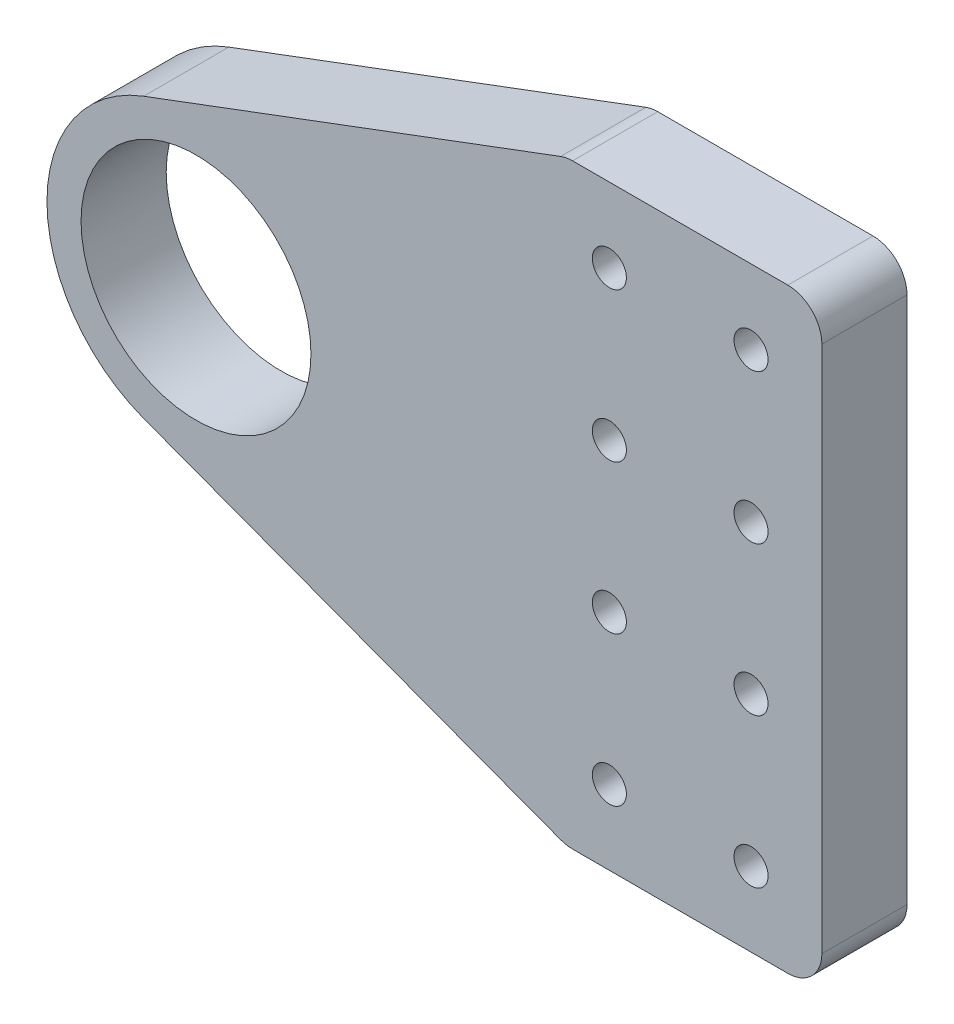
ISO-10303-21;
HEADER;
FILE_DESCRIPTION(('STEP AP214'),'2;1');
FILE_NAME('part.step','',(''),(''),'','','');
FILE_SCHEMA(('AUTOMOTIVE_DESIGN { 1 0 10303 214 1 1 1 1 }'));
ENDSEC;
DATA;
#1=APPLICATION_CONTEXT('core data for automotive mechanical design processes');
#2=APPLICATION_PROTOCOL_DEFINITION('international standard','automotive_design',2000,#1);
#3=PRODUCT_CONTEXT('',#1,'mechanical');
#4=PRODUCT('Part','Part','',(#3));
#5=PRODUCT_RELATED_PRODUCT_CATEGORY('part','',(#4));
#6=PRODUCT_DEFINITION_FORMATION('','',#4);
#7=PRODUCT_DEFINITION_CONTEXT('part definition',#1,'design');
#8=PRODUCT_DEFINITION('design','',#6,#7);
#9=PRODUCT_DEFINITION_SHAPE('','',#8);
#10=(LENGTH_UNIT() NAMED_UNIT(*) SI_UNIT(.MILLI.,.METRE.));
#11=(NAMED_UNIT(*) PLANE_ANGLE_UNIT() SI_UNIT($,.RADIAN.));
#12=(NAMED_UNIT(*) SI_UNIT($,.STERADIAN.) SOLID_ANGLE_UNIT());
#13=UNCERTAINTY_MEASURE_WITH_UNIT(LENGTH_MEASURE(1.E-05),#10,'distance_accuracy_value','');
#14=(GEOMETRIC_REPRESENTATION_CONTEXT(3) GLOBAL_UNCERTAINTY_ASSIGNED_CONTEXT((#13)) GLOBAL_UNIT_ASSIGNED_CONTEXT((#10,
#11,#12)) REPRESENTATION_CONTEXT('',''));
#15=CARTESIAN_POINT('',(0.,0.,0.));
#16=DIRECTION('',(0.,0.,1.));
#17=DIRECTION('',(1.,0.,0.));
#18=AXIS2_PLACEMENT_3D('',#15,#16,#17);
#19=CARTESIAN_POINT('',(821.055,-247.65,12.7));
#20=DIRECTION('',(0.,0.,1.));
#21=DIRECTION('',(1.,0.,0.));
#22=AXIS2_PLACEMENT_3D('',#19,#20,#21);
#23=PLANE('',#22);
#24=CARTESIAN_POINT('',(903.835265866674,-258.748026915631,12.7));
#25=DIRECTION('',(0.,0.,1.));
#26=DIRECTION('',(1.,0.,0.));
#27=AXIS2_PLACEMENT_3D('',#24,#25,#26);
#28=CIRCLE('',#27,2.53999999999996);
#29=CARTESIAN_POINT('',(906.375265866674,-258.748026915631,12.7));
#30=VERTEX_POINT('',#29);
#31=EDGE_CURVE('E248',#30,#30,#28,.T.);
#32=ORIENTED_EDGE('',*,*,#31,.F.);
#33=EDGE_LOOP('',(#32));
#34=FACE_BOUND('',#33,.T.);
#35=CARTESIAN_POINT('',(882.705797600023,-258.748026915631,12.7));
#36=DIRECTION('',(0.,0.,1.));
#37=DIRECTION('',(-1.,0.,0.));
#38=AXIS2_PLACEMENT_3D('',#35,#36,#37);
#39=CIRCLE('',#38,2.53999999999996);
#40=CARTESIAN_POINT('',(880.165797600023,-258.748026915631,12.7));
#41=VERTEX_POINT('',#40);
#42=EDGE_CURVE('E236',#41,#41,#39,.T.);
#43=ORIENTED_EDGE('',*,*,#42,.F.);
#44=EDGE_LOOP('',(#43));
#45=FACE_BOUND('',#44,.T.);
#46=CARTESIAN_POINT('',(882.705797600023,-236.551973084369,12.7));
#47=DIRECTION('',(0.,0.,1.));
#48=DIRECTION('',(1.,0.,0.));
#49=AXIS2_PLACEMENT_3D('',#46,#47,#48);
#50=CIRCLE('',#49,2.53999999999996);
#51=CARTESIAN_POINT('',(885.245797600023,-236.551973084369,12.7));
#52=VERTEX_POINT('',#51);
#53=EDGE_CURVE('E224',#52,#52,#50,.T.);
#54=ORIENTED_EDGE('',*,*,#53,.F.);
#55=EDGE_LOOP('',(#54));
#56=FACE_BOUND('',#55,.T.);
#57=CARTESIAN_POINT('',(821.055,-247.65,12.7));
#58=DIRECTION('',(0.,0.,1.));
#59=DIRECTION('',(1.,0.,0.));
#60=AXIS2_PLACEMENT_3D('',#57,#58,#59);
#61=CIRCLE('',#60,17.145);
#62=CARTESIAN_POINT('',(838.2,-247.65,12.7));
#63=VERTEX_POINT('',#62);
#64=EDGE_CURVE('E212',#63,#63,#61,.T.);
#65=ORIENTED_EDGE('',*,*,#64,.F.);
#66=EDGE_LOOP('',(#65));
#67=FACE_BOUND('',#66,.T.);
#68=CARTESIAN_POINT('',(821.055,-247.65,12.7));
#69=DIRECTION('',(0.,0.,1.));
#70=DIRECTION('',(1.,0.,0.));
#71=AXIS2_PLACEMENT_3D('',#68,#69,#70);
#72=CIRCLE('',#71,22.225);
#73=CARTESIAN_POINT('',(813.252203296095,-226.83973838229,12.7));
#74=VERTEX_POINT('',#73);
#75=CARTESIAN_POINT('',(813.252203296095,-268.46026161771,12.7));
#76=VERTEX_POINT('',#75);
#77=EDGE_CURVE('E161',#74,#76,#72,.T.);
#78=ORIENTED_EDGE('',*,*,#77,.T.);
#79=DIRECTION('',(0.936344729705738,-0.351081966429904,0.));
#80=VECTOR('',#79,1.);
#81=CARTESIAN_POINT('',(875.437567077233,-291.776631226905,12.7));
#82=LINE('',#81,#80);
#83=CARTESIAN_POINT('',(875.437567077233,-291.776631226905,12.7));
#84=VERTEX_POINT('',#83);
#85=EDGE_CURVE('E99',#76,#84,#82,.T.);
#86=ORIENTED_EDGE('',*,*,#85,.T.);
#87=CARTESIAN_POINT('',(877.221063466697,-287.02,12.7));
#88=DIRECTION('',(0.,0.,1.));
#89=DIRECTION('',(-1.,0.,0.));
#90=AXIS2_PLACEMENT_3D('',#87,#88,#89);
#91=CIRCLE('',#90,5.07999999999998);
#92=CARTESIAN_POINT('',(877.221063466697,-292.1,12.7));
#93=VERTEX_POINT('',#92);
#94=EDGE_CURVE('E182',#84,#93,#91,.T.);
#95=ORIENTED_EDGE('',*,*,#94,.T.);
#96=DIRECTION('',(1.,0.,0.));
#97=VECTOR('',#96,1.);
#98=CARTESIAN_POINT('',(877.221063466697,-292.1,12.7));
#99=LINE('',#98,#97);
#100=CARTESIAN_POINT('',(909.32,-292.1,12.7));
#101=VERTEX_POINT('',#100);
#102=EDGE_CURVE('E201',#93,#101,#99,.T.);
#103=ORIENTED_EDGE('',*,*,#102,.T.);
#104=CARTESIAN_POINT('',(909.32,-287.02,12.7));
#105=DIRECTION('',(0.,0.,1.));
#106=DIRECTION('',(1.,0.,0.));
#107=AXIS2_PLACEMENT_3D('',#104,#105,#106);
#108=CIRCLE('',#107,5.07999999999997);
#109=CARTESIAN_POINT('',(914.4,-287.02,12.7));
#110=VERTEX_POINT('',#109);
#111=EDGE_CURVE('E198',#101,#110,#108,.T.);
#112=ORIENTED_EDGE('',*,*,#111,.T.);
#113=DIRECTION('',(0.,1.,0.));
#114=VECTOR('',#113,1.);
#115=CARTESIAN_POINT('',(914.4,-287.02,12.7));
#116=LINE('',#115,#114);
#117=CARTESIAN_POINT('',(914.4,-208.28,12.7));
#118=VERTEX_POINT('',#117);
#119=EDGE_CURVE('E200',#110,#118,#116,.T.);
#120=ORIENTED_EDGE('',*,*,#119,.T.);
#121=CARTESIAN_POINT('',(909.32,-208.28,12.7));
#122=DIRECTION('',(0.,0.,1.));
#123=DIRECTION('',(-1.,0.,0.));
#124=AXIS2_PLACEMENT_3D('',#121,#122,#123);
#125=CIRCLE('',#124,5.07999999999999);
#126=CARTESIAN_POINT('',(909.32,-203.2,12.7));
#127=VERTEX_POINT('',#126);
#128=EDGE_CURVE('E124',#118,#127,#125,.T.);
#129=ORIENTED_EDGE('',*,*,#128,.T.);
#130=DIRECTION('',(-1.,0.,0.));
#131=VECTOR('',#130,1.);
#132=CARTESIAN_POINT('',(877.221063466697,-203.2,12.7));
#133=LINE('',#132,#131);
#134=CARTESIAN_POINT('',(877.221063466697,-203.2,12.7));
#135=VERTEX_POINT('',#134);
#136=EDGE_CURVE('E118',#127,#135,#133,.T.);
#137=ORIENTED_EDGE('',*,*,#136,.T.);
#138=CARTESIAN_POINT('',(877.221063466697,-208.28,12.7));
#139=DIRECTION('',(0.,0.,1.));
#140=DIRECTION('',(1.,0.,0.));
#141=AXIS2_PLACEMENT_3D('',#138,#139,#140);
#142=CIRCLE('',#141,5.08000000000001);
#143=CARTESIAN_POINT('',(875.437567077233,-203.523368773095,12.7));
#144=VERTEX_POINT('',#143);
#145=EDGE_CURVE('E122',#135,#144,#142,.T.);
#146=ORIENTED_EDGE('',*,*,#145,.T.);
#147=DIRECTION('',(-0.936344729705738,-0.351081966429904,0.));
#148=VECTOR('',#147,1.);
#149=CARTESIAN_POINT('',(875.437567077233,-203.523368773095,12.7));
#150=LINE('',#149,#148);
#151=EDGE_CURVE('E50',#144,#74,#150,.T.);
#152=ORIENTED_EDGE('',*,*,#151,.T.);
#153=EDGE_LOOP('',(#78,#86,#95,#103,#112,#120,#129,#137,#146,#152));
#154=FACE_BOUND('',#153,.T.);
#155=CARTESIAN_POINT('',(903.835265866674,-214.298026915631,12.7));
#156=DIRECTION('',(0.,0.,1.));
#157=DIRECTION('',(1.,0.,0.));
#158=AXIS2_PLACEMENT_3D('',#155,#156,#157);
#159=CIRCLE('',#158,2.53999999999996);
#160=CARTESIAN_POINT('',(906.375265866674,-214.298026915631,12.7));
#161=VERTEX_POINT('',#160);
#162=EDGE_CURVE('E146',#161,#161,#159,.T.);
#163=ORIENTED_EDGE('',*,*,#162,.F.);
#164=EDGE_LOOP('',(#163));
#165=FACE_BOUND('',#164,.T.);
#166=CARTESIAN_POINT('',(882.705797600023,-214.298026915631,12.7));
#167=DIRECTION('',(0.,0.,1.));
#168=DIRECTION('',(-1.,0.,0.));
#169=AXIS2_PLACEMENT_3D('',#166,#167,#168);
#170=CIRCLE('',#169,2.53999999999996);
#171=CARTESIAN_POINT('',(880.165797600023,-214.298026915631,12.7));
#172=VERTEX_POINT('',#171);
#173=EDGE_CURVE('E218',#172,#172,#170,.T.);
#174=ORIENTED_EDGE('',*,*,#173,.F.);
#175=EDGE_LOOP('',(#174));
#176=FACE_BOUND('',#175,.T.);
#177=CARTESIAN_POINT('',(903.835265866674,-236.551973084369,12.7));
#178=DIRECTION('',(0.,0.,1.));
#179=DIRECTION('',(-1.,0.,0.));
#180=AXIS2_PLACEMENT_3D('',#177,#178,#179);
#181=CIRCLE('',#180,2.53999999999996);
#182=CARTESIAN_POINT('',(901.295265866674,-236.551973084369,12.7));
#183=VERTEX_POINT('',#182);
#184=EDGE_CURVE('E230',#183,#183,#181,.T.);
#185=ORIENTED_EDGE('',*,*,#184,.F.);
#186=EDGE_LOOP('',(#185));
#187=FACE_BOUND('',#186,.T.);
#188=CARTESIAN_POINT('',(882.705797600023,-281.001973084369,12.7));
#189=DIRECTION('',(0.,0.,1.));
#190=DIRECTION('',(1.,0.,0.));
#191=AXIS2_PLACEMENT_3D('',#188,#189,#190);
#192=CIRCLE('',#191,2.53999999999996);
#193=CARTESIAN_POINT('',(885.245797600023,-281.001973084369,12.7));
#194=VERTEX_POINT('',#193);
#195=EDGE_CURVE('E242',#194,#194,#192,.T.);
#196=ORIENTED_EDGE('',*,*,#195,.F.);
#197=EDGE_LOOP('',(#196));
#198=FACE_BOUND('',#197,.T.);
#199=CARTESIAN_POINT('',(903.835265866674,-281.001973084369,12.7));
#200=DIRECTION('',(0.,0.,1.));
#201=DIRECTION('',(-1.,0.,0.));
#202=AXIS2_PLACEMENT_3D('',#199,#200,#201);
#203=CIRCLE('',#202,2.53999999999996);
#204=CARTESIAN_POINT('',(901.295265866674,-281.001973084369,12.7));
#205=VERTEX_POINT('',#204);
#206=EDGE_CURVE('E254',#205,#205,#203,.T.);
#207=ORIENTED_EDGE('',*,*,#206,.F.);
#208=EDGE_LOOP('',(#207));
#209=FACE_BOUND('',#208,.T.);
#210=ADVANCED_FACE('F33',(#34,#45,#56,#67,#154,#165,#176,#187,#198,#209),#23,.T.);
#211=CARTESIAN_POINT('',(821.055,-247.65,0.));
#212=DIRECTION('',(0.,0.,1.));
#213=DIRECTION('',(1.,0.,0.));
#214=AXIS2_PLACEMENT_3D('',#211,#212,#213);
#215=PLANE('',#214);
#216=CARTESIAN_POINT('',(821.055,-247.65,0.));
#217=DIRECTION('',(0.,0.,1.));
#218=DIRECTION('',(1.,0.,0.));
#219=AXIS2_PLACEMENT_3D('',#216,#217,#218);
#220=CIRCLE('',#219,22.225);
#221=CARTESIAN_POINT('',(813.252203296095,-226.83973838229,0.));
#222=VERTEX_POINT('',#221);
#223=CARTESIAN_POINT('',(813.252203296095,-268.46026161771,0.));
#224=VERTEX_POINT('',#223);
#225=EDGE_CURVE('E142',#222,#224,#220,.T.);
#226=ORIENTED_EDGE('',*,*,#225,.F.);
#227=DIRECTION('',(-0.936344729705738,-0.351081966429904,0.));
#228=VECTOR('',#227,1.);
#229=CARTESIAN_POINT('',(875.437567077233,-203.523368773095,0.));
#230=LINE('',#229,#228);
#231=CARTESIAN_POINT('',(875.437567077233,-203.523368773095,0.));
#232=VERTEX_POINT('',#231);
#233=EDGE_CURVE('E91',#232,#222,#230,.T.);
#234=ORIENTED_EDGE('',*,*,#233,.F.);
#235=CARTESIAN_POINT('',(877.221063466697,-208.28,0.));
#236=DIRECTION('',(0.,0.,1.));
#237=DIRECTION('',(1.,0.,0.));
#238=AXIS2_PLACEMENT_3D('',#235,#236,#237);
#239=CIRCLE('',#238,5.08000000000001);
#240=CARTESIAN_POINT('',(877.221063466697,-203.2,0.));
#241=VERTEX_POINT('',#240);
#242=EDGE_CURVE('E85',#241,#232,#239,.T.);
#243=ORIENTED_EDGE('',*,*,#242,.F.);
#244=DIRECTION('',(-1.,0.,0.));
#245=VECTOR('',#244,1.);
#246=CARTESIAN_POINT('',(877.221063466697,-203.2,0.));
#247=LINE('',#246,#245);
#248=CARTESIAN_POINT('',(909.32,-203.2,0.));
#249=VERTEX_POINT('',#248);
#250=EDGE_CURVE('E132',#249,#241,#247,.T.);
#251=ORIENTED_EDGE('',*,*,#250,.F.);
#252=CARTESIAN_POINT('',(909.32,-208.28,0.));
#253=DIRECTION('',(0.,0.,1.));
#254=DIRECTION('',(-1.,0.,0.));
#255=AXIS2_PLACEMENT_3D('',#252,#253,#254);
#256=CIRCLE('',#255,5.07999999999999);
#257=CARTESIAN_POINT('',(914.4,-208.28,0.));
#258=VERTEX_POINT('',#257);
#259=EDGE_CURVE('E156',#258,#249,#256,.T.);
#260=ORIENTED_EDGE('',*,*,#259,.F.);
#261=DIRECTION('',(0.,1.,0.));
#262=VECTOR('',#261,1.);
#263=CARTESIAN_POINT('',(914.4,-287.02,0.));
#264=LINE('',#263,#262);
#265=CARTESIAN_POINT('',(914.4,-287.02,0.));
#266=VERTEX_POINT('',#265);
#267=EDGE_CURVE('E154',#266,#258,#264,.T.);
#268=ORIENTED_EDGE('',*,*,#267,.F.);
#269=CARTESIAN_POINT('',(909.32,-287.02,0.));
#270=DIRECTION('',(0.,0.,1.));
#271=DIRECTION('',(1.,0.,0.));
#272=AXIS2_PLACEMENT_3D('',#269,#270,#271);
#273=CIRCLE('',#272,5.07999999999997);
#274=CARTESIAN_POINT('',(909.32,-292.1,0.));
#275=VERTEX_POINT('',#274);
#276=EDGE_CURVE('E152',#275,#266,#273,.T.);
#277=ORIENTED_EDGE('',*,*,#276,.F.);
#278=DIRECTION('',(1.,0.,0.));
#279=VECTOR('',#278,1.);
#280=CARTESIAN_POINT('',(877.221063466697,-292.1,0.));
#281=LINE('',#280,#279);
#282=CARTESIAN_POINT('',(877.221063466697,-292.1,0.));
#283=VERTEX_POINT('',#282);
#284=EDGE_CURVE('E150',#283,#275,#281,.T.);
#285=ORIENTED_EDGE('',*,*,#284,.F.);
#286=CARTESIAN_POINT('',(877.221063466697,-287.02,0.));
#287=DIRECTION('',(0.,0.,1.));
#288=DIRECTION('',(-1.,0.,0.));
#289=AXIS2_PLACEMENT_3D('',#286,#287,#288);
#290=CIRCLE('',#289,5.07999999999998);
#291=CARTESIAN_POINT('',(875.437567077233,-291.776631226905,0.));
#292=VERTEX_POINT('',#291);
#293=EDGE_CURVE('E148',#292,#283,#290,.T.);
#294=ORIENTED_EDGE('',*,*,#293,.F.);
#295=DIRECTION('',(0.936344729705738,-0.351081966429904,0.));
#296=VECTOR('',#295,1.);
#297=CARTESIAN_POINT('',(875.437567077233,-291.776631226905,0.));
#298=LINE('',#297,#296);
#299=EDGE_CURVE('E145',#224,#292,#298,.T.);
#300=ORIENTED_EDGE('',*,*,#299,.F.);
#301=EDGE_LOOP('',(#226,#234,#243,#251,#260,#268,#277,#285,#294,#300));
#302=FACE_BOUND('',#301,.T.);
#303=CARTESIAN_POINT('',(903.835265866674,-214.298026915631,0.));
#304=DIRECTION('',(0.,0.,1.));
#305=DIRECTION('',(1.,0.,0.));
#306=AXIS2_PLACEMENT_3D('',#303,#304,#305);
#307=CIRCLE('',#306,2.53999999999996);
#308=CARTESIAN_POINT('',(906.375265866674,-214.298026915631,0.));
#309=VERTEX_POINT('',#308);
#310=EDGE_CURVE('E209',#309,#309,#307,.T.);
#311=ORIENTED_EDGE('',*,*,#310,.T.);
#312=EDGE_LOOP('',(#311));
#313=FACE_BOUND('',#312,.T.);
#314=CARTESIAN_POINT('',(821.055,-247.65,0.));
#315=DIRECTION('',(0.,0.,1.));
#316=DIRECTION('',(1.,0.,0.));
#317=AXIS2_PLACEMENT_3D('',#314,#315,#316);
#318=CIRCLE('',#317,17.145);
#319=CARTESIAN_POINT('',(838.2,-247.65,0.));
#320=VERTEX_POINT('',#319);
#321=EDGE_CURVE('E215',#320,#320,#318,.T.);
#322=ORIENTED_EDGE('',*,*,#321,.T.);
#323=EDGE_LOOP('',(#322));
#324=FACE_BOUND('',#323,.T.);
#325=CARTESIAN_POINT('',(882.705797600023,-214.298026915631,0.));
#326=DIRECTION('',(0.,0.,1.));
#327=DIRECTION('',(-1.,0.,0.));
#328=AXIS2_PLACEMENT_3D('',#325,#326,#327);
#329=CIRCLE('',#328,2.53999999999996);
#330=CARTESIAN_POINT('',(880.165797600023,-214.298026915631,0.));
#331=VERTEX_POINT('',#330);
#332=EDGE_CURVE('E221',#331,#331,#329,.T.);
#333=ORIENTED_EDGE('',*,*,#332,.T.);
#334=EDGE_LOOP('',(#333));
#335=FACE_BOUND('',#334,.T.);
#336=CARTESIAN_POINT('',(882.705797600023,-236.551973084369,0.));
#337=DIRECTION('',(0.,0.,1.));
#338=DIRECTION('',(1.,0.,0.));
#339=AXIS2_PLACEMENT_3D('',#336,#337,#338);
#340=CIRCLE('',#339,2.53999999999996);
#341=CARTESIAN_POINT('',(885.245797600023,-236.551973084369,0.));
#342=VERTEX_POINT('',#341);
#343=EDGE_CURVE('E227',#342,#342,#340,.T.);
#344=ORIENTED_EDGE('',*,*,#343,.T.);
#345=EDGE_LOOP('',(#344));
#346=FACE_BOUND('',#345,.T.);
#347=CARTESIAN_POINT('',(903.835265866674,-236.551973084369,0.));
#348=DIRECTION('',(0.,0.,1.));
#349=DIRECTION('',(-1.,0.,0.));
#350=AXIS2_PLACEMENT_3D('',#347,#348,#349);
#351=CIRCLE('',#350,2.53999999999996);
#352=CARTESIAN_POINT('',(901.295265866674,-236.551973084369,0.));
#353=VERTEX_POINT('',#352);
#354=EDGE_CURVE('E233',#353,#353,#351,.T.);
#355=ORIENTED_EDGE('',*,*,#354,.T.);
#356=EDGE_LOOP('',(#355));
#357=FACE_BOUND('',#356,.T.);
#358=CARTESIAN_POINT('',(882.705797600023,-258.748026915631,0.));
#359=DIRECTION('',(0.,0.,1.));
#360=DIRECTION('',(-1.,0.,0.));
#361=AXIS2_PLACEMENT_3D('',#358,#359,#360);
#362=CIRCLE('',#361,2.53999999999996);
#363=CARTESIAN_POINT('',(880.165797600023,-258.748026915631,0.));
#364=VERTEX_POINT('',#363);
#365=EDGE_CURVE('E239',#364,#364,#362,.T.);
#366=ORIENTED_EDGE('',*,*,#365,.T.);
#367=EDGE_LOOP('',(#366));
#368=FACE_BOUND('',#367,.T.);
#369=CARTESIAN_POINT('',(882.705797600023,-281.001973084369,0.));
#370=DIRECTION('',(0.,0.,1.));
#371=DIRECTION('',(1.,0.,0.));
#372=AXIS2_PLACEMENT_3D('',#369,#370,#371);
#373=CIRCLE('',#372,2.53999999999996);
#374=CARTESIAN_POINT('',(885.245797600023,-281.001973084369,0.));
#375=VERTEX_POINT('',#374);
#376=EDGE_CURVE('E245',#375,#375,#373,.T.);
#377=ORIENTED_EDGE('',*,*,#376,.T.);
#378=EDGE_LOOP('',(#377));
#379=FACE_BOUND('',#378,.T.);
#380=CARTESIAN_POINT('',(903.835265866674,-258.748026915631,0.));
#381=DIRECTION('',(0.,0.,1.));
#382=DIRECTION('',(1.,0.,0.));
#383=AXIS2_PLACEMENT_3D('',#380,#381,#382);
#384=CIRCLE('',#383,2.53999999999996);
#385=CARTESIAN_POINT('',(906.375265866674,-258.748026915631,0.));
#386=VERTEX_POINT('',#385);
#387=EDGE_CURVE('E251',#386,#386,#384,.T.);
#388=ORIENTED_EDGE('',*,*,#387,.T.);
#389=EDGE_LOOP('',(#388));
#390=FACE_BOUND('',#389,.T.);
#391=CARTESIAN_POINT('',(903.835265866674,-281.001973084369,0.));
#392=DIRECTION('',(0.,0.,1.));
#393=DIRECTION('',(-1.,0.,0.));
#394=AXIS2_PLACEMENT_3D('',#391,#392,#393);
#395=CIRCLE('',#394,2.53999999999996);
#396=CARTESIAN_POINT('',(901.295265866674,-281.001973084369,0.));
#397=VERTEX_POINT('',#396);
#398=EDGE_CURVE('E257',#397,#397,#395,.T.);
#399=ORIENTED_EDGE('',*,*,#398,.T.);
#400=EDGE_LOOP('',(#399));
#401=FACE_BOUND('',#400,.T.);
#402=ADVANCED_FACE('F186',(#302,#313,#324,#335,#346,#357,#368,#379,#390,#401),#215,.F.);
#403=CARTESIAN_POINT('',(821.055,-247.65,12.7));
#404=DIRECTION('',(0.,0.,-1.));
#405=DIRECTION('',(-1.,0.,0.));
#406=AXIS2_PLACEMENT_3D('',#403,#404,#405);
#407=CYLINDRICAL_SURFACE('',#406,22.225);
#408=ORIENTED_EDGE('',*,*,#225,.T.);
#409=DIRECTION('',(0.,0.,-1.));
#410=VECTOR('',#409,1.);
#411=CARTESIAN_POINT('',(813.252203296095,-268.46026161771,12.7));
#412=LINE('',#411,#410);
#413=EDGE_CURVE('E11',#76,#224,#412,.T.);
#414=ORIENTED_EDGE('',*,*,#413,.F.);
#415=ORIENTED_EDGE('',*,*,#77,.F.);
#416=DIRECTION('',(0.,0.,-1.));
#417=VECTOR('',#416,1.);
#418=CARTESIAN_POINT('',(813.252203296095,-226.83973838229,12.7));
#419=LINE('',#418,#417);
#420=EDGE_CURVE('E138',#74,#222,#419,.T.);
#421=ORIENTED_EDGE('',*,*,#420,.T.);
#422=EDGE_LOOP('',(#408,#414,#415,#421));
#423=FACE_BOUND('',#422,.T.);
#424=ADVANCED_FACE('F35',(#423),#407,.T.);
#425=CARTESIAN_POINT('',(875.437567077233,-291.776631226905,12.7));
#426=DIRECTION('',(0.351081966429904,0.936344729705738,0.));
#427=DIRECTION('',(-0.936344729705738,0.351081966429904,0.));
#428=AXIS2_PLACEMENT_3D('',#425,#426,#427);
#429=PLANE('',#428);
#430=ORIENTED_EDGE('',*,*,#299,.T.);
#431=DIRECTION('',(0.,0.,-1.));
#432=VECTOR('',#431,1.);
#433=CARTESIAN_POINT('',(875.437567077233,-291.776631226905,12.7));
#434=LINE('',#433,#432);
#435=EDGE_CURVE('E42',#84,#292,#434,.T.);
#436=ORIENTED_EDGE('',*,*,#435,.F.);
#437=ORIENTED_EDGE('',*,*,#85,.F.);
#438=ORIENTED_EDGE('',*,*,#413,.T.);
#439=EDGE_LOOP('',(#430,#436,#437,#438));
#440=FACE_BOUND('',#439,.T.);
#441=ADVANCED_FACE('F299',(#440),#429,.F.);
#442=CARTESIAN_POINT('',(877.221063466697,-287.02,12.7));
#443=DIRECTION('',(0.,0.,-1.));
#444=DIRECTION('',(-1.,0.,0.));
#445=AXIS2_PLACEMENT_3D('',#442,#443,#444);
#446=CYLINDRICAL_SURFACE('',#445,5.07999999999998);
#447=ORIENTED_EDGE('',*,*,#293,.T.);
#448=DIRECTION('',(0.,0.,-1.));
#449=VECTOR('',#448,1.);
#450=CARTESIAN_POINT('',(877.221063466697,-292.1,12.7));
#451=LINE('',#450,#449);
#452=EDGE_CURVE('E174',#93,#283,#451,.T.);
#453=ORIENTED_EDGE('',*,*,#452,.F.);
#454=ORIENTED_EDGE('',*,*,#94,.F.);
#455=ORIENTED_EDGE('',*,*,#435,.T.);
#456=EDGE_LOOP('',(#447,#453,#454,#455));
#457=FACE_BOUND('',#456,.T.);
#458=ADVANCED_FACE('F180',(#457),#446,.T.);
#459=CARTESIAN_POINT('',(877.221063466697,-292.1,12.7));
#460=DIRECTION('',(0.,1.,0.));
#461=DIRECTION('',(0.,0.,1.));
#462=AXIS2_PLACEMENT_3D('',#459,#460,#461);
#463=PLANE('',#462);
#464=ORIENTED_EDGE('',*,*,#284,.T.);
#465=DIRECTION('',(0.,0.,-1.));
#466=VECTOR('',#465,1.);
#467=CARTESIAN_POINT('',(909.32,-292.1,12.7));
#468=LINE('',#467,#466);
#469=EDGE_CURVE('E171',#101,#275,#468,.T.);
#470=ORIENTED_EDGE('',*,*,#469,.F.);
#471=ORIENTED_EDGE('',*,*,#102,.F.);
#472=ORIENTED_EDGE('',*,*,#452,.T.);
#473=EDGE_LOOP('',(#464,#470,#471,#472));
#474=FACE_BOUND('',#473,.T.);
#475=ADVANCED_FACE('F192',(#474),#463,.F.);
#476=CARTESIAN_POINT('',(909.32,-287.02,12.7));
#477=DIRECTION('',(0.,0.,-1.));
#478=DIRECTION('',(-1.,0.,0.));
#479=AXIS2_PLACEMENT_3D('',#476,#477,#478);
#480=CYLINDRICAL_SURFACE('',#479,5.07999999999997);
#481=ORIENTED_EDGE('',*,*,#276,.T.);
#482=DIRECTION('',(0.,0.,-1.));
#483=VECTOR('',#482,1.);
#484=CARTESIAN_POINT('',(914.4,-287.02,12.7));
#485=LINE('',#484,#483);
#486=EDGE_CURVE('E168',#110,#266,#485,.T.);
#487=ORIENTED_EDGE('',*,*,#486,.F.);
#488=ORIENTED_EDGE('',*,*,#111,.F.);
#489=ORIENTED_EDGE('',*,*,#469,.T.);
#490=EDGE_LOOP('',(#481,#487,#488,#489));
#491=FACE_BOUND('',#490,.T.);
#492=ADVANCED_FACE('F196',(#491),#480,.T.);
#493=CARTESIAN_POINT('',(914.4,-287.02,12.7));
#494=DIRECTION('',(-1.,0.,0.));
#495=DIRECTION('',(0.,0.,1.));
#496=AXIS2_PLACEMENT_3D('',#493,#494,#495);
#497=PLANE('',#496);
#498=ORIENTED_EDGE('',*,*,#267,.T.);
#499=DIRECTION('',(0.,0.,-1.));
#500=VECTOR('',#499,1.);
#501=CARTESIAN_POINT('',(914.4,-208.28,12.7));
#502=LINE('',#501,#500);
#503=EDGE_CURVE('E165',#118,#258,#502,.T.);
#504=ORIENTED_EDGE('',*,*,#503,.F.);
#505=ORIENTED_EDGE('',*,*,#119,.F.);
#506=ORIENTED_EDGE('',*,*,#486,.T.);
#507=EDGE_LOOP('',(#498,#504,#505,#506));
#508=FACE_BOUND('',#507,.T.);
#509=ADVANCED_FACE('F289',(#508),#497,.F.);
#510=CARTESIAN_POINT('',(909.32,-208.28,12.7));
#511=DIRECTION('',(0.,0.,-1.));
#512=DIRECTION('',(-1.,0.,0.));
#513=AXIS2_PLACEMENT_3D('',#510,#511,#512);
#514=CYLINDRICAL_SURFACE('',#513,5.07999999999999);
#515=ORIENTED_EDGE('',*,*,#259,.T.);
#516=DIRECTION('',(0.,0.,-1.));
#517=VECTOR('',#516,1.);
#518=CARTESIAN_POINT('',(909.32,-203.2,12.7));
#519=LINE('',#518,#517);
#520=EDGE_CURVE('E133',#127,#249,#519,.T.);
#521=ORIENTED_EDGE('',*,*,#520,.F.);
#522=ORIENTED_EDGE('',*,*,#128,.F.);
#523=ORIENTED_EDGE('',*,*,#503,.T.);
#524=EDGE_LOOP('',(#515,#521,#522,#523));
#525=FACE_BOUND('',#524,.T.);
#526=ADVANCED_FACE('F286',(#525),#514,.T.);
#527=CARTESIAN_POINT('',(877.221063466697,-203.2,12.7));
#528=DIRECTION('',(0.,-1.,0.));
#529=DIRECTION('',(0.,0.,-1.));
#530=AXIS2_PLACEMENT_3D('',#527,#528,#529);
#531=PLANE('',#530);
#532=ORIENTED_EDGE('',*,*,#250,.T.);
#533=DIRECTION('',(0.,0.,-1.));
#534=VECTOR('',#533,1.);
#535=CARTESIAN_POINT('',(877.221063466697,-203.2,12.7));
#536=LINE('',#535,#534);
#537=EDGE_CURVE('E129',#135,#241,#536,.T.);
#538=ORIENTED_EDGE('',*,*,#537,.F.);
#539=ORIENTED_EDGE('',*,*,#136,.F.);
#540=ORIENTED_EDGE('',*,*,#520,.T.);
#541=EDGE_LOOP('',(#532,#538,#539,#540));
#542=FACE_BOUND('',#541,.T.);
#543=ADVANCED_FACE('F130',(#542),#531,.F.);
#544=CARTESIAN_POINT('',(877.221063466697,-208.28,12.7));
#545=DIRECTION('',(0.,0.,-1.));
#546=DIRECTION('',(-1.,0.,0.));
#547=AXIS2_PLACEMENT_3D('',#544,#545,#546);
#548=CYLINDRICAL_SURFACE('',#547,5.08000000000001);
#549=ORIENTED_EDGE('',*,*,#242,.T.);
#550=DIRECTION('',(0.,0.,-1.));
#551=VECTOR('',#550,1.);
#552=CARTESIAN_POINT('',(875.437567077233,-203.523368773095,12.7));
#553=LINE('',#552,#551);
#554=EDGE_CURVE('E134',#144,#232,#553,.T.);
#555=ORIENTED_EDGE('',*,*,#554,.F.);
#556=ORIENTED_EDGE('',*,*,#145,.F.);
#557=ORIENTED_EDGE('',*,*,#537,.T.);
#558=EDGE_LOOP('',(#549,#555,#556,#557));
#559=FACE_BOUND('',#558,.T.);
#560=ADVANCED_FACE('F136',(#559),#548,.T.);
#561=CARTESIAN_POINT('',(875.437567077233,-203.523368773095,12.7));
#562=DIRECTION('',(0.351081966429904,-0.936344729705738,0.));
#563=DIRECTION('',(0.936344729705738,0.351081966429904,0.));
#564=AXIS2_PLACEMENT_3D('',#561,#562,#563);
#565=PLANE('',#564);
#566=ORIENTED_EDGE('',*,*,#233,.T.);
#567=ORIENTED_EDGE('',*,*,#420,.F.);
#568=ORIENTED_EDGE('',*,*,#151,.F.);
#569=ORIENTED_EDGE('',*,*,#554,.T.);
#570=EDGE_LOOP('',(#566,#567,#568,#569));
#571=FACE_BOUND('',#570,.T.);
#572=ADVANCED_FACE('F279',(#571),#565,.F.);
#573=CARTESIAN_POINT('',(903.835265866674,-214.298026915631,12.7));
#574=DIRECTION('',(0.,0.,-1.));
#575=DIRECTION('',(-1.,0.,0.));
#576=AXIS2_PLACEMENT_3D('',#573,#574,#575);
#577=CYLINDRICAL_SURFACE('',#576,2.53999999999996);
#578=ORIENTED_EDGE('',*,*,#162,.T.);
#579=EDGE_LOOP('',(#578));
#580=FACE_BOUND('',#579,.T.);
#581=ORIENTED_EDGE('',*,*,#310,.F.);
#582=EDGE_LOOP('',(#581));
#583=FACE_BOUND('',#582,.T.);
#584=ADVANCED_FACE('F276',(#580,#583),#577,.F.);
#585=CARTESIAN_POINT('',(821.055,-247.65,12.7));
#586=DIRECTION('',(0.,0.,-1.));
#587=DIRECTION('',(-1.,0.,0.));
#588=AXIS2_PLACEMENT_3D('',#585,#586,#587);
#589=CYLINDRICAL_SURFACE('',#588,17.145);
#590=ORIENTED_EDGE('',*,*,#64,.T.);
#591=EDGE_LOOP('',(#590));
#592=FACE_BOUND('',#591,.T.);
#593=ORIENTED_EDGE('',*,*,#321,.F.);
#594=EDGE_LOOP('',(#593));
#595=FACE_BOUND('',#594,.T.);
#596=ADVANCED_FACE('F375',(#592,#595),#589,.F.);
#597=CARTESIAN_POINT('',(882.705797600023,-214.298026915631,12.7));
#598=DIRECTION('',(0.,0.,-1.));
#599=DIRECTION('',(-1.,0.,0.));
#600=AXIS2_PLACEMENT_3D('',#597,#598,#599);
#601=CYLINDRICAL_SURFACE('',#600,2.53999999999996);
#602=ORIENTED_EDGE('',*,*,#173,.T.);
#603=EDGE_LOOP('',(#602));
#604=FACE_BOUND('',#603,.T.);
#605=ORIENTED_EDGE('',*,*,#332,.F.);
#606=EDGE_LOOP('',(#605));
#607=FACE_BOUND('',#606,.T.);
#608=ADVANCED_FACE('F383',(#604,#607),#601,.F.);
#609=CARTESIAN_POINT('',(882.705797600023,-236.551973084369,12.7));
#610=DIRECTION('',(0.,0.,-1.));
#611=DIRECTION('',(-1.,0.,0.));
#612=AXIS2_PLACEMENT_3D('',#609,#610,#611);
#613=CYLINDRICAL_SURFACE('',#612,2.53999999999996);
#614=ORIENTED_EDGE('',*,*,#53,.T.);
#615=EDGE_LOOP('',(#614));
#616=FACE_BOUND('',#615,.T.);
#617=ORIENTED_EDGE('',*,*,#343,.F.);
#618=EDGE_LOOP('',(#617));
#619=FACE_BOUND('',#618,.T.);
#620=ADVANCED_FACE('F391',(#616,#619),#613,.F.);
#621=CARTESIAN_POINT('',(903.835265866674,-236.551973084369,12.7));
#622=DIRECTION('',(0.,0.,-1.));
#623=DIRECTION('',(-1.,0.,0.));
#624=AXIS2_PLACEMENT_3D('',#621,#622,#623);
#625=CYLINDRICAL_SURFACE('',#624,2.53999999999996);
#626=ORIENTED_EDGE('',*,*,#184,.T.);
#627=EDGE_LOOP('',(#626));
#628=FACE_BOUND('',#627,.T.);
#629=ORIENTED_EDGE('',*,*,#354,.F.);
#630=EDGE_LOOP('',(#629));
#631=FACE_BOUND('',#630,.T.);
#632=ADVANCED_FACE('F400',(#628,#631),#625,.F.);
#633=CARTESIAN_POINT('',(882.705797600023,-258.748026915631,12.7));
#634=DIRECTION('',(0.,0.,-1.));
#635=DIRECTION('',(-1.,0.,0.));
#636=AXIS2_PLACEMENT_3D('',#633,#634,#635);
#637=CYLINDRICAL_SURFACE('',#636,2.53999999999996);
#638=ORIENTED_EDGE('',*,*,#42,.T.);
#639=EDGE_LOOP('',(#638));
#640=FACE_BOUND('',#639,.T.);
#641=ORIENTED_EDGE('',*,*,#365,.F.);
#642=EDGE_LOOP('',(#641));
#643=FACE_BOUND('',#642,.T.);
#644=ADVANCED_FACE('F409',(#640,#643),#637,.F.);
#645=CARTESIAN_POINT('',(882.705797600023,-281.001973084369,12.7));
#646=DIRECTION('',(0.,0.,-1.));
#647=DIRECTION('',(-1.,0.,0.));
#648=AXIS2_PLACEMENT_3D('',#645,#646,#647);
#649=CYLINDRICAL_SURFACE('',#648,2.53999999999996);
#650=ORIENTED_EDGE('',*,*,#195,.T.);
#651=EDGE_LOOP('',(#650));
#652=FACE_BOUND('',#651,.T.);
#653=ORIENTED_EDGE('',*,*,#376,.F.);
#654=EDGE_LOOP('',(#653));
#655=FACE_BOUND('',#654,.T.);
#656=ADVANCED_FACE('F418',(#652,#655),#649,.F.);
#657=CARTESIAN_POINT('',(903.835265866674,-258.748026915631,12.7));
#658=DIRECTION('',(0.,0.,-1.));
#659=DIRECTION('',(-1.,0.,0.));
#660=AXIS2_PLACEMENT_3D('',#657,#658,#659);
#661=CYLINDRICAL_SURFACE('',#660,2.53999999999996);
#662=ORIENTED_EDGE('',*,*,#31,.T.);
#663=EDGE_LOOP('',(#662));
#664=FACE_BOUND('',#663,.T.);
#665=ORIENTED_EDGE('',*,*,#387,.F.);
#666=EDGE_LOOP('',(#665));
#667=FACE_BOUND('',#666,.T.);
#668=ADVANCED_FACE('F427',(#664,#667),#661,.F.);
#669=CARTESIAN_POINT('',(903.835265866674,-281.001973084369,12.7));
#670=DIRECTION('',(0.,0.,-1.));
#671=DIRECTION('',(-1.,0.,0.));
#672=AXIS2_PLACEMENT_3D('',#669,#670,#671);
#673=CYLINDRICAL_SURFACE('',#672,2.53999999999996);
#674=ORIENTED_EDGE('',*,*,#206,.T.);
#675=EDGE_LOOP('',(#674));
#676=FACE_BOUND('',#675,.T.);
#677=ORIENTED_EDGE('',*,*,#398,.F.);
#678=EDGE_LOOP('',(#677));
#679=FACE_BOUND('',#678,.T.);
#680=ADVANCED_FACE('F263',(#676,#679),#673,.F.);
#681=CLOSED_SHELL('',(#210,#402,#424,#441,#458,#475,#492,#509,#526,#543,#560,#572,#584,#596,
#608,#620,#632,#644,#656,#668,#680));
#682=MANIFOLD_SOLID_BREP('B2',#681);
#683=ADVANCED_BREP_SHAPE_REPRESENTATION('',(#18,#682),#14);
#684=SHAPE_DEFINITION_REPRESENTATION(#9,#683);
ENDSEC;
END-ISO-10303-21;
